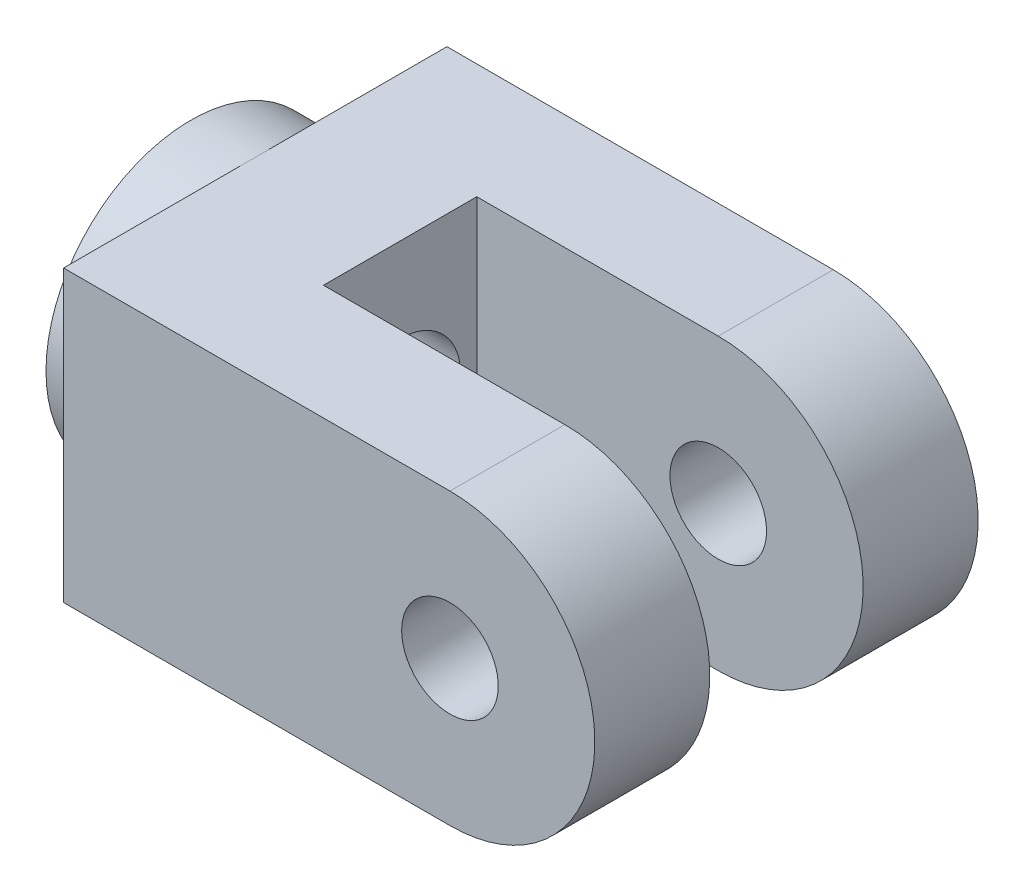
ISO-10303-21;
HEADER;
FILE_DESCRIPTION(('STEP AP214'),'2;1');
FILE_NAME('part.step','',(''),(''),'','','');
FILE_SCHEMA(('AUTOMOTIVE_DESIGN { 1 0 10303 214 1 1 1 1 }'));
ENDSEC;
DATA;
#1=APPLICATION_CONTEXT('core data for automotive mechanical design processes');
#2=APPLICATION_PROTOCOL_DEFINITION('international standard','automotive_design',2000,#1);
#3=PRODUCT_CONTEXT('',#1,'mechanical');
#4=PRODUCT('Part','Part','',(#3));
#5=PRODUCT_RELATED_PRODUCT_CATEGORY('part','',(#4));
#6=PRODUCT_DEFINITION_FORMATION('','',#4);
#7=PRODUCT_DEFINITION_CONTEXT('part definition',#1,'design');
#8=PRODUCT_DEFINITION('design','',#6,#7);
#9=PRODUCT_DEFINITION_SHAPE('','',#8);
#10=(LENGTH_UNIT() NAMED_UNIT(*) SI_UNIT(.MILLI.,.METRE.));
#11=(NAMED_UNIT(*) PLANE_ANGLE_UNIT() SI_UNIT($,.RADIAN.));
#12=(NAMED_UNIT(*) SI_UNIT($,.STERADIAN.) SOLID_ANGLE_UNIT());
#13=UNCERTAINTY_MEASURE_WITH_UNIT(LENGTH_MEASURE(1.E-05),#10,'distance_accuracy_value','');
#14=(GEOMETRIC_REPRESENTATION_CONTEXT(3) GLOBAL_UNCERTAINTY_ASSIGNED_CONTEXT((#13)) GLOBAL_UNIT_ASSIGNED_CONTEXT((#10,
#11,#12)) REPRESENTATION_CONTEXT('',''));
#15=CARTESIAN_POINT('',(0.,0.,0.));
#16=DIRECTION('',(0.,0.,1.));
#17=DIRECTION('',(1.,0.,0.));
#18=AXIS2_PLACEMENT_3D('',#15,#16,#17);
#19=CARTESIAN_POINT('',(-66.,36.,47.625));
#20=DIRECTION('',(1.,0.,0.));
#21=DIRECTION('',(0.,0.,-1.));
#22=AXIS2_PLACEMENT_3D('',#19,#20,#21);
#23=PLANE('',#22);
#24=CARTESIAN_POINT('',(-66.,0.,0.));
#25=DIRECTION('',(-1.,0.,0.));
#26=DIRECTION('',(0.,0.,1.));
#27=AXIS2_PLACEMENT_3D('',#24,#25,#26);
#28=CIRCLE('',#27,36.);
#29=CARTESIAN_POINT('',(-66.,36.,0.));
#30=VERTEX_POINT('',#29);
#31=CARTESIAN_POINT('',(-66.,-36.,0.));
#32=VERTEX_POINT('',#31);
#33=EDGE_CURVE('E50',#30,#32,#28,.T.);
#34=ORIENTED_EDGE('',*,*,#33,.F.);
#35=DIRECTION('',(0.,0.,-1.));
#36=VECTOR('',#35,1.);
#37=CARTESIAN_POINT('',(-66.,36.,47.625));
#38=LINE('',#37,#36);
#39=CARTESIAN_POINT('',(-66.,36.,-47.625));
#40=VERTEX_POINT('',#39);
#41=EDGE_CURVE('E117',#30,#40,#38,.T.);
#42=ORIENTED_EDGE('',*,*,#41,.T.);
#43=DIRECTION('',(0.,-1.,0.));
#44=VECTOR('',#43,1.);
#45=CARTESIAN_POINT('',(-66.,36.,-47.625));
#46=LINE('',#45,#44);
#47=CARTESIAN_POINT('',(-66.,-36.,-47.625));
#48=VERTEX_POINT('',#47);
#49=EDGE_CURVE('E235',#40,#48,#46,.T.);
#50=ORIENTED_EDGE('',*,*,#49,.T.);
#51=DIRECTION('',(0.,0.,-1.));
#52=VECTOR('',#51,1.);
#53=CARTESIAN_POINT('',(-66.,-36.,47.625));
#54=LINE('',#53,#52);
#55=EDGE_CURVE('E129',#32,#48,#54,.T.);
#56=ORIENTED_EDGE('',*,*,#55,.F.);
#57=EDGE_LOOP('',(#34,#42,#50,#56));
#58=FACE_BOUND('',#57,.T.);
#59=ADVANCED_FACE('F39',(#58),#23,.F.);
#60=CARTESIAN_POINT('',(30.,0.,174.862929799012));
#61=DIRECTION('',(0.,0.,-1.));
#62=DIRECTION('',(-1.,0.,0.));
#63=AXIS2_PLACEMENT_3D('',#60,#61,#62);
#64=CYLINDRICAL_SURFACE('',#63,36.);
#65=CARTESIAN_POINT('',(30.,0.,-19.045));
#66=DIRECTION('',(0.,0.,1.));
#67=DIRECTION('',(1.,0.,0.));
#68=AXIS2_PLACEMENT_3D('',#65,#66,#67);
#69=CIRCLE('',#68,36.);
#70=CARTESIAN_POINT('',(30.,36.,-19.045));
#71=VERTEX_POINT('',#70);
#72=CARTESIAN_POINT('',(30.,-36.,-19.045));
#73=VERTEX_POINT('',#72);
#74=EDGE_CURVE('E216',#71,#73,#69,.F.);
#75=ORIENTED_EDGE('',*,*,#74,.T.);
#76=DIRECTION('',(0.,0.,-1.));
#77=VECTOR('',#76,1.);
#78=CARTESIAN_POINT('',(30.0000023561729,-36.,174.862929799012));
#79=LINE('',#78,#77);
#80=CARTESIAN_POINT('',(30.,-36.,-47.625));
#81=VERTEX_POINT('',#80);
#82=EDGE_CURVE('E196',#73,#81,#79,.T.);
#83=ORIENTED_EDGE('',*,*,#82,.T.);
#84=CARTESIAN_POINT('',(30.,0.,-47.625));
#85=DIRECTION('',(0.,0.,1.));
#86=DIRECTION('',(1.,0.,0.));
#87=AXIS2_PLACEMENT_3D('',#84,#85,#86);
#88=CIRCLE('',#87,36.);
#89=CARTESIAN_POINT('',(30.,36.,-47.625));
#90=VERTEX_POINT('',#89);
#91=EDGE_CURVE('E48',#81,#90,#88,.T.);
#92=ORIENTED_EDGE('',*,*,#91,.T.);
#93=DIRECTION('',(0.,0.,-1.));
#94=VECTOR('',#93,1.);
#95=CARTESIAN_POINT('',(30.,36.,174.862929799012));
#96=LINE('',#95,#94);
#97=EDGE_CURVE('E218',#71,#90,#96,.T.);
#98=ORIENTED_EDGE('',*,*,#97,.F.);
#99=EDGE_LOOP('',(#75,#83,#92,#98));
#100=FACE_BOUND('',#99,.T.);
#101=ADVANCED_FACE('F153',(#100),#64,.T.);
#102=CARTESIAN_POINT('',(-66.,-36.,47.625));
#103=DIRECTION('',(0.,1.,0.));
#104=DIRECTION('',(0.,0.,1.));
#105=AXIS2_PLACEMENT_3D('',#102,#103,#104);
#106=PLANE('',#105);
#107=DIRECTION('',(1.,0.,0.));
#108=VECTOR('',#107,1.);
#109=CARTESIAN_POINT('',(0.,-36.,-19.045));
#110=LINE('',#109,#108);
#111=CARTESIAN_POINT('',(-30.,-36.,-19.045));
#112=VERTEX_POINT('',#111);
#113=EDGE_CURVE('E191',#112,#73,#110,.T.);
#114=ORIENTED_EDGE('',*,*,#113,.F.);
#115=DIRECTION('',(0.,0.,1.));
#116=VECTOR('',#115,1.);
#117=CARTESIAN_POINT('',(-30.,-36.,0.));
#118=LINE('',#117,#116);
#119=CARTESIAN_POINT('',(-30.,-36.,19.055));
#120=VERTEX_POINT('',#119);
#121=EDGE_CURVE('E194',#112,#120,#118,.T.);
#122=ORIENTED_EDGE('',*,*,#121,.T.);
#123=DIRECTION('',(1.,0.,0.));
#124=VECTOR('',#123,1.);
#125=CARTESIAN_POINT('',(0.,-36.,19.055));
#126=LINE('',#125,#124);
#127=CARTESIAN_POINT('',(30.,-36.,19.055));
#128=VERTEX_POINT('',#127);
#129=EDGE_CURVE('E199',#120,#128,#126,.T.);
#130=ORIENTED_EDGE('',*,*,#129,.T.);
#131=CARTESIAN_POINT('',(30.,-36.,47.625));
#132=VERTEX_POINT('',#131);
#133=EDGE_CURVE('E219',#132,#128,#79,.T.);
#134=ORIENTED_EDGE('',*,*,#133,.F.);
#135=DIRECTION('',(1.,0.,0.));
#136=VECTOR('',#135,1.);
#137=CARTESIAN_POINT('',(-66.,-36.,47.625));
#138=LINE('',#137,#136);
#139=CARTESIAN_POINT('',(-66.,-36.,47.625));
#140=VERTEX_POINT('',#139);
#141=EDGE_CURVE('E231',#140,#132,#138,.T.);
#142=ORIENTED_EDGE('',*,*,#141,.F.);
#143=EDGE_CURVE('E127',#140,#32,#54,.T.);
#144=ORIENTED_EDGE('',*,*,#143,.T.);
#145=ORIENTED_EDGE('',*,*,#55,.T.);
#146=DIRECTION('',(1.,0.,0.));
#147=VECTOR('',#146,1.);
#148=CARTESIAN_POINT('',(-66.,-36.,-47.625));
#149=LINE('',#148,#147);
#150=EDGE_CURVE('E229',#48,#81,#149,.T.);
#151=ORIENTED_EDGE('',*,*,#150,.T.);
#152=ORIENTED_EDGE('',*,*,#82,.F.);
#153=EDGE_LOOP('',(#114,#122,#130,#134,#142,#144,#145,#151,#152));
#154=FACE_BOUND('',#153,.T.);
#155=ADVANCED_FACE('F157',(#154),#106,.F.);
#156=CARTESIAN_POINT('',(-66.,36.,47.625));
#157=DIRECTION('',(0.,-1.,0.));
#158=DIRECTION('',(0.,0.,-1.));
#159=AXIS2_PLACEMENT_3D('',#156,#157,#158);
#160=PLANE('',#159);
#161=DIRECTION('',(1.,0.,0.));
#162=VECTOR('',#161,1.);
#163=CARTESIAN_POINT('',(0.,36.,-19.045));
#164=LINE('',#163,#162);
#165=CARTESIAN_POINT('',(-30.,36.,-19.045));
#166=VERTEX_POINT('',#165);
#167=EDGE_CURVE('E211',#166,#71,#164,.T.);
#168=ORIENTED_EDGE('',*,*,#167,.T.);
#169=ORIENTED_EDGE('',*,*,#97,.T.);
#170=DIRECTION('',(-1.,0.,0.));
#171=VECTOR('',#170,1.);
#172=CARTESIAN_POINT('',(-66.,36.,-47.625));
#173=LINE('',#172,#171);
#174=EDGE_CURVE('E123',#90,#40,#173,.T.);
#175=ORIENTED_EDGE('',*,*,#174,.T.);
#176=ORIENTED_EDGE('',*,*,#41,.F.);
#177=CARTESIAN_POINT('',(-66.,36.,47.625));
#178=VERTEX_POINT('',#177);
#179=EDGE_CURVE('E111',#178,#30,#38,.T.);
#180=ORIENTED_EDGE('',*,*,#179,.F.);
#181=DIRECTION('',(-1.,0.,0.));
#182=VECTOR('',#181,1.);
#183=CARTESIAN_POINT('',(-66.,36.,47.625));
#184=LINE('',#183,#182);
#185=CARTESIAN_POINT('',(30.,36.,47.625));
#186=VERTEX_POINT('',#185);
#187=EDGE_CURVE('E227',#186,#178,#184,.T.);
#188=ORIENTED_EDGE('',*,*,#187,.F.);
#189=CARTESIAN_POINT('',(30.,36.,19.055));
#190=VERTEX_POINT('',#189);
#191=EDGE_CURVE('E223',#186,#190,#96,.T.);
#192=ORIENTED_EDGE('',*,*,#191,.T.);
#193=DIRECTION('',(1.,0.,0.));
#194=VECTOR('',#193,1.);
#195=CARTESIAN_POINT('',(0.,36.,19.055));
#196=LINE('',#195,#194);
#197=CARTESIAN_POINT('',(-30.,36.,19.055));
#198=VERTEX_POINT('',#197);
#199=EDGE_CURVE('E207',#198,#190,#196,.T.);
#200=ORIENTED_EDGE('',*,*,#199,.F.);
#201=DIRECTION('',(0.,0.,1.));
#202=VECTOR('',#201,1.);
#203=CARTESIAN_POINT('',(-30.,36.,0.));
#204=LINE('',#203,#202);
#205=EDGE_CURVE('E63',#166,#198,#204,.T.);
#206=ORIENTED_EDGE('',*,*,#205,.F.);
#207=EDGE_LOOP('',(#168,#169,#175,#176,#180,#188,#192,#200,#206));
#208=FACE_BOUND('',#207,.T.);
#209=ADVANCED_FACE('F41',(#208),#160,.F.);
#210=CARTESIAN_POINT('',(30.,0.,19.055));
#211=DIRECTION('',(0.,0.,1.));
#212=DIRECTION('',(1.,0.,0.));
#213=AXIS2_PLACEMENT_3D('',#210,#211,#212);
#214=CIRCLE('',#213,36.);
#215=EDGE_CURVE('E213',#190,#128,#214,.F.);
#216=ORIENTED_EDGE('',*,*,#215,.F.);
#217=ORIENTED_EDGE('',*,*,#191,.F.);
#218=CARTESIAN_POINT('',(30.,0.,47.625));
#219=DIRECTION('',(0.,0.,1.));
#220=DIRECTION('',(1.,0.,0.));
#221=AXIS2_PLACEMENT_3D('',#218,#219,#220);
#222=CIRCLE('',#221,36.);
#223=EDGE_CURVE('E222',#132,#186,#222,.T.);
#224=ORIENTED_EDGE('',*,*,#223,.F.);
#225=ORIENTED_EDGE('',*,*,#133,.T.);
#226=EDGE_LOOP('',(#216,#217,#224,#225));
#227=FACE_BOUND('',#226,.T.);
#228=ADVANCED_FACE('F160',(#227),#64,.T.);
#229=CARTESIAN_POINT('',(0.,0.,47.625));
#230=DIRECTION('',(0.,0.,1.));
#231=DIRECTION('',(1.,0.,0.));
#232=AXIS2_PLACEMENT_3D('',#229,#230,#231);
#233=PLANE('',#232);
#234=CARTESIAN_POINT('',(30.,0.,47.625));
#235=DIRECTION('',(0.,0.,-1.));
#236=DIRECTION('',(-1.,0.,0.));
#237=AXIS2_PLACEMENT_3D('',#234,#235,#236);
#238=CIRCLE('',#237,12.);
#239=CARTESIAN_POINT('',(18.,0.,47.625));
#240=VERTEX_POINT('',#239);
#241=EDGE_CURVE('E253',#240,#240,#238,.T.);
#242=ORIENTED_EDGE('',*,*,#241,.T.);
#243=EDGE_LOOP('',(#242));
#244=FACE_BOUND('',#243,.T.);
#245=ORIENTED_EDGE('',*,*,#223,.T.);
#246=ORIENTED_EDGE('',*,*,#187,.T.);
#247=DIRECTION('',(0.,-1.,0.));
#248=VECTOR('',#247,1.);
#249=CARTESIAN_POINT('',(-66.,36.,47.625));
#250=LINE('',#249,#248);
#251=EDGE_CURVE('E114',#178,#140,#250,.T.);
#252=ORIENTED_EDGE('',*,*,#251,.T.);
#253=ORIENTED_EDGE('',*,*,#141,.T.);
#254=EDGE_LOOP('',(#245,#246,#252,#253));
#255=FACE_BOUND('',#254,.T.);
#256=ADVANCED_FACE('F172',(#244,#255),#233,.T.);
#257=CARTESIAN_POINT('',(0.,0.,-47.625));
#258=DIRECTION('',(0.,0.,1.));
#259=DIRECTION('',(1.,0.,0.));
#260=AXIS2_PLACEMENT_3D('',#257,#258,#259);
#261=PLANE('',#260);
#262=CARTESIAN_POINT('',(30.,0.,-47.625));
#263=DIRECTION('',(0.,0.,-1.));
#264=DIRECTION('',(-1.,0.,0.));
#265=AXIS2_PLACEMENT_3D('',#262,#263,#264);
#266=CIRCLE('',#265,12.);
#267=CARTESIAN_POINT('',(18.,0.,-47.625));
#268=VERTEX_POINT('',#267);
#269=EDGE_CURVE('E250',#268,#268,#266,.T.);
#270=ORIENTED_EDGE('',*,*,#269,.F.);
#271=EDGE_LOOP('',(#270));
#272=FACE_BOUND('',#271,.T.);
#273=ORIENTED_EDGE('',*,*,#174,.F.);
#274=ORIENTED_EDGE('',*,*,#91,.F.);
#275=ORIENTED_EDGE('',*,*,#150,.F.);
#276=ORIENTED_EDGE('',*,*,#49,.F.);
#277=EDGE_LOOP('',(#273,#274,#275,#276));
#278=FACE_BOUND('',#277,.T.);
#279=ADVANCED_FACE('F164',(#272,#278),#261,.F.);
#280=EDGE_CURVE('E12',#32,#30,#28,.T.);
#281=ORIENTED_EDGE('',*,*,#280,.F.);
#282=ORIENTED_EDGE('',*,*,#143,.F.);
#283=ORIENTED_EDGE('',*,*,#251,.F.);
#284=ORIENTED_EDGE('',*,*,#179,.T.);
#285=EDGE_LOOP('',(#281,#282,#283,#284));
#286=FACE_BOUND('',#285,.T.);
#287=ADVANCED_FACE('F113',(#286),#23,.F.);
#288=CARTESIAN_POINT('',(-30.,-36.,0.));
#289=DIRECTION('',(-1.,0.,0.));
#290=DIRECTION('',(0.,0.,1.));
#291=AXIS2_PLACEMENT_3D('',#288,#289,#290);
#292=PLANE('',#291);
#293=CARTESIAN_POINT('',(-30.,0.,0.));
#294=DIRECTION('',(-1.,0.,0.));
#295=DIRECTION('',(0.,0.,1.));
#296=AXIS2_PLACEMENT_3D('',#293,#294,#295);
#297=CIRCLE('',#296,15.);
#298=CARTESIAN_POINT('',(-30.,0.,15.));
#299=VERTEX_POINT('',#298);
#300=EDGE_CURVE('E208',#299,#299,#297,.T.);
#301=ORIENTED_EDGE('',*,*,#300,.T.);
#302=EDGE_LOOP('',(#301));
#303=FACE_BOUND('',#302,.T.);
#304=ORIENTED_EDGE('',*,*,#205,.T.);
#305=DIRECTION('',(0.,1.,0.));
#306=VECTOR('',#305,1.);
#307=CARTESIAN_POINT('',(-30.,-36.,19.055));
#308=LINE('',#307,#306);
#309=EDGE_CURVE('E198',#120,#198,#308,.T.);
#310=ORIENTED_EDGE('',*,*,#309,.F.);
#311=ORIENTED_EDGE('',*,*,#121,.F.);
#312=DIRECTION('',(0.,1.,0.));
#313=VECTOR('',#312,1.);
#314=CARTESIAN_POINT('',(-30.,-36.,-19.045));
#315=LINE('',#314,#313);
#316=EDGE_CURVE('E201',#112,#166,#315,.T.);
#317=ORIENTED_EDGE('',*,*,#316,.T.);
#318=EDGE_LOOP('',(#304,#310,#311,#317));
#319=FACE_BOUND('',#318,.T.);
#320=ADVANCED_FACE('F163',(#303,#319),#292,.F.);
#321=CARTESIAN_POINT('',(0.,-36.,-19.045));
#322=DIRECTION('',(0.,0.,1.));
#323=DIRECTION('',(1.,0.,0.));
#324=AXIS2_PLACEMENT_3D('',#321,#322,#323);
#325=PLANE('',#324);
#326=CARTESIAN_POINT('',(30.,0.,-19.045));
#327=DIRECTION('',(0.,0.,1.));
#328=DIRECTION('',(1.,0.,0.));
#329=AXIS2_PLACEMENT_3D('',#326,#327,#328);
#330=CIRCLE('',#329,12.);
#331=CARTESIAN_POINT('',(42.,0.,-19.045));
#332=VERTEX_POINT('',#331);
#333=EDGE_CURVE('E247',#332,#332,#330,.T.);
#334=ORIENTED_EDGE('',*,*,#333,.F.);
#335=EDGE_LOOP('',(#334));
#336=FACE_BOUND('',#335,.T.);
#337=ORIENTED_EDGE('',*,*,#74,.F.);
#338=ORIENTED_EDGE('',*,*,#167,.F.);
#339=ORIENTED_EDGE('',*,*,#316,.F.);
#340=ORIENTED_EDGE('',*,*,#113,.T.);
#341=EDGE_LOOP('',(#337,#338,#339,#340));
#342=FACE_BOUND('',#341,.T.);
#343=ADVANCED_FACE('F169',(#336,#342),#325,.T.);
#344=CARTESIAN_POINT('',(0.,-36.,19.055));
#345=DIRECTION('',(0.,0.,1.));
#346=DIRECTION('',(1.,0.,0.));
#347=AXIS2_PLACEMENT_3D('',#344,#345,#346);
#348=PLANE('',#347);
#349=CARTESIAN_POINT('',(30.,0.,19.055));
#350=DIRECTION('',(0.,0.,1.));
#351=DIRECTION('',(1.,0.,0.));
#352=AXIS2_PLACEMENT_3D('',#349,#350,#351);
#353=CIRCLE('',#352,12.);
#354=CARTESIAN_POINT('',(42.,0.,19.055));
#355=VERTEX_POINT('',#354);
#356=EDGE_CURVE('E43',#355,#355,#353,.T.);
#357=ORIENTED_EDGE('',*,*,#356,.T.);
#358=EDGE_LOOP('',(#357));
#359=FACE_BOUND('',#358,.T.);
#360=ORIENTED_EDGE('',*,*,#215,.T.);
#361=ORIENTED_EDGE('',*,*,#129,.F.);
#362=ORIENTED_EDGE('',*,*,#309,.T.);
#363=ORIENTED_EDGE('',*,*,#199,.T.);
#364=EDGE_LOOP('',(#360,#361,#362,#363));
#365=FACE_BOUND('',#364,.T.);
#366=ADVANCED_FACE('F259',(#359,#365),#348,.F.);
#367=CARTESIAN_POINT('',(66.,0.,0.));
#368=DIRECTION('',(-1.,0.,0.));
#369=DIRECTION('',(0.,0.,1.));
#370=AXIS2_PLACEMENT_3D('',#367,#368,#369);
#371=CYLINDRICAL_SURFACE('',#370,15.);
#372=ORIENTED_EDGE('',*,*,#300,.F.);
#373=EDGE_LOOP('',(#372));
#374=FACE_BOUND('',#373,.T.);
#375=CARTESIAN_POINT('',(-82.,0.,0.));
#376=DIRECTION('',(-1.,0.,0.));
#377=DIRECTION('',(0.,0.,1.));
#378=AXIS2_PLACEMENT_3D('',#375,#376,#377);
#379=CIRCLE('',#378,15.);
#380=CARTESIAN_POINT('',(-82.,0.,15.));
#381=VERTEX_POINT('',#380);
#382=EDGE_CURVE('E133',#381,#381,#379,.T.);
#383=ORIENTED_EDGE('',*,*,#382,.T.);
#384=EDGE_LOOP('',(#383));
#385=FACE_BOUND('',#384,.T.);
#386=ADVANCED_FACE('F147',(#374,#385),#371,.F.);
#387=CARTESIAN_POINT('',(-82.,0.,0.));
#388=DIRECTION('',(-1.,0.,0.));
#389=DIRECTION('',(0.,0.,1.));
#390=AXIS2_PLACEMENT_3D('',#387,#388,#389);
#391=PLANE('',#390);
#392=CARTESIAN_POINT('',(-82.,0.,0.));
#393=DIRECTION('',(-1.,0.,0.));
#394=DIRECTION('',(0.,0.,1.));
#395=AXIS2_PLACEMENT_3D('',#392,#393,#394);
#396=CIRCLE('',#395,36.);
#397=CARTESIAN_POINT('',(-82.,0.,36.));
#398=VERTEX_POINT('',#397);
#399=EDGE_CURVE('E132',#398,#398,#396,.T.);
#400=ORIENTED_EDGE('',*,*,#399,.T.);
#401=EDGE_LOOP('',(#400));
#402=FACE_BOUND('',#401,.T.);
#403=ORIENTED_EDGE('',*,*,#382,.F.);
#404=EDGE_LOOP('',(#403));
#405=FACE_BOUND('',#404,.T.);
#406=ADVANCED_FACE('F137',(#402,#405),#391,.T.);
#407=CARTESIAN_POINT('',(-82.,0.,0.));
#408=DIRECTION('',(1.,0.,0.));
#409=DIRECTION('',(0.,0.,-1.));
#410=AXIS2_PLACEMENT_3D('',#407,#408,#409);
#411=CYLINDRICAL_SURFACE('',#410,36.);
#412=ORIENTED_EDGE('',*,*,#399,.F.);
#413=EDGE_LOOP('',(#412));
#414=FACE_BOUND('',#413,.T.);
#415=ORIENTED_EDGE('',*,*,#33,.T.);
#416=ORIENTED_EDGE('',*,*,#280,.T.);
#417=EDGE_LOOP('',(#415,#416));
#418=FACE_BOUND('',#417,.T.);
#419=ADVANCED_FACE('F134',(#414,#418),#411,.T.);
#420=CARTESIAN_POINT('',(30.,0.,47.625));
#421=DIRECTION('',(0.,0.,-1.));
#422=DIRECTION('',(-1.,0.,0.));
#423=AXIS2_PLACEMENT_3D('',#420,#421,#422);
#424=CYLINDRICAL_SURFACE('',#423,12.);
#425=ORIENTED_EDGE('',*,*,#241,.F.);
#426=EDGE_LOOP('',(#425));
#427=FACE_BOUND('',#426,.T.);
#428=ORIENTED_EDGE('',*,*,#356,.F.);
#429=EDGE_LOOP('',(#428));
#430=FACE_BOUND('',#429,.T.);
#431=ADVANCED_FACE('F136',(#427,#430),#424,.F.);
#432=ORIENTED_EDGE('',*,*,#333,.T.);
#433=EDGE_LOOP('',(#432));
#434=FACE_BOUND('',#433,.T.);
#435=ORIENTED_EDGE('',*,*,#269,.T.);
#436=EDGE_LOOP('',(#435));
#437=FACE_BOUND('',#436,.T.);
#438=ADVANCED_FACE('F144',(#434,#437),#424,.F.);
#439=CLOSED_SHELL('',(#59,#101,#155,#209,#228,#256,#279,#287,#320,#343,#366,#386,#406,#419,#431,#438));
#440=MANIFOLD_SOLID_BREP('B2',#439);
#441=ADVANCED_BREP_SHAPE_REPRESENTATION('',(#18,#440),#14);
#442=SHAPE_DEFINITION_REPRESENTATION(#9,#441);
ENDSEC;
END-ISO-10303-21;
